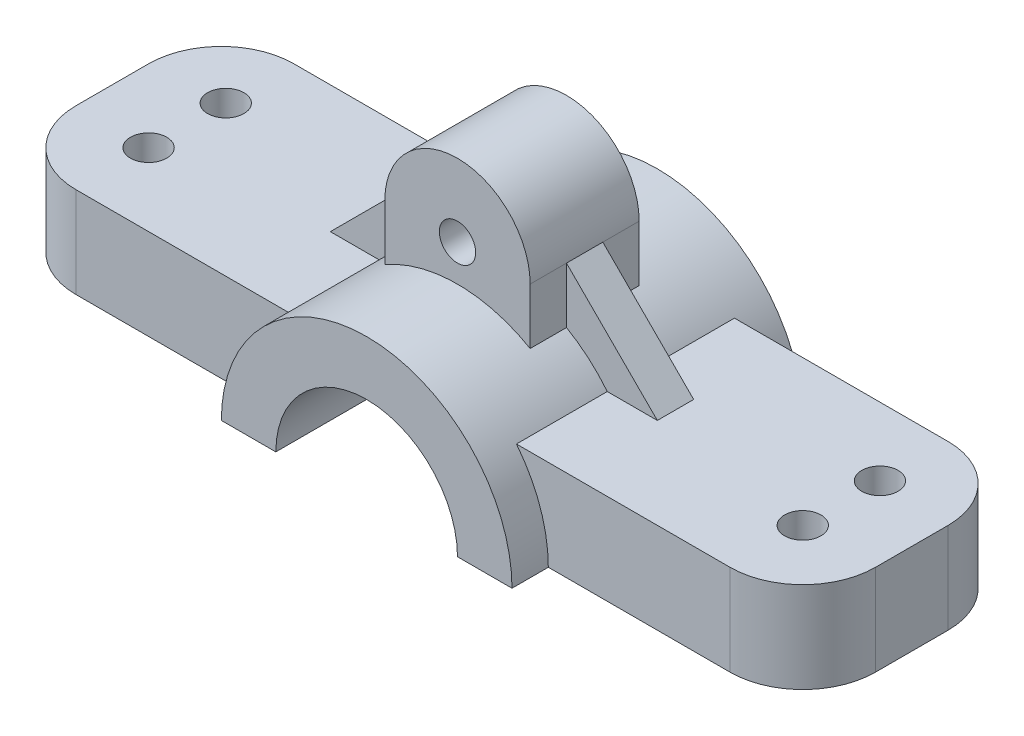
ISO-10303-21;
HEADER;
FILE_DESCRIPTION(('STEP AP214'),'2;1');
FILE_NAME('part.step','',(''),(''),'','','');
FILE_SCHEMA(('AUTOMOTIVE_DESIGN { 1 0 10303 214 1 1 1 1 }'));
ENDSEC;
DATA;
#1=APPLICATION_CONTEXT('core data for automotive mechanical design processes');
#2=APPLICATION_PROTOCOL_DEFINITION('international standard','automotive_design',2000,#1);
#3=PRODUCT_CONTEXT('',#1,'mechanical');
#4=PRODUCT('Part','Part','',(#3));
#5=PRODUCT_RELATED_PRODUCT_CATEGORY('part','',(#4));
#6=PRODUCT_DEFINITION_FORMATION('','',#4);
#7=PRODUCT_DEFINITION_CONTEXT('part definition',#1,'design');
#8=PRODUCT_DEFINITION('design','',#6,#7);
#9=PRODUCT_DEFINITION_SHAPE('','',#8);
#10=(LENGTH_UNIT() NAMED_UNIT(*) SI_UNIT(.MILLI.,.METRE.));
#11=(NAMED_UNIT(*) PLANE_ANGLE_UNIT() SI_UNIT($,.RADIAN.));
#12=(NAMED_UNIT(*) SI_UNIT($,.STERADIAN.) SOLID_ANGLE_UNIT());
#13=UNCERTAINTY_MEASURE_WITH_UNIT(LENGTH_MEASURE(1.E-05),#10,'distance_accuracy_value','');
#14=(GEOMETRIC_REPRESENTATION_CONTEXT(3) GLOBAL_UNCERTAINTY_ASSIGNED_CONTEXT((#13)) GLOBAL_UNIT_ASSIGNED_CONTEXT((#10,
#11,#12)) REPRESENTATION_CONTEXT('',''));
#15=CARTESIAN_POINT('',(0.,0.,0.));
#16=DIRECTION('',(0.,0.,1.));
#17=DIRECTION('',(1.,0.,0.));
#18=AXIS2_PLACEMENT_3D('',#15,#16,#17);
#19=CARTESIAN_POINT('',(0.,0.,40.));
#20=DIRECTION('',(0.,0.,-1.));
#21=DIRECTION('',(-1.,0.,0.));
#22=AXIS2_PLACEMENT_3D('',#19,#20,#21);
#23=CYLINDRICAL_SURFACE('',#22,40.);
#24=CARTESIAN_POINT('',(0.,0.,-5.));
#25=DIRECTION('',(0.,0.,1.));
#26=DIRECTION('',(1.,0.,0.));
#27=AXIS2_PLACEMENT_3D('',#24,#25,#26);
#28=CIRCLE('',#27,40.);
#29=CARTESIAN_POINT('',(31.224989991992,25.,-5.));
#30=VERTEX_POINT('',#29);
#31=CARTESIAN_POINT('',(20.,34.6410161513775,-5.));
#32=VERTEX_POINT('',#31);
#33=EDGE_CURVE('E253',#30,#32,#28,.T.);
#34=ORIENTED_EDGE('',*,*,#33,.F.);
#35=DIRECTION('',(0.,0.,-1.));
#36=VECTOR('',#35,1.);
#37=CARTESIAN_POINT('',(31.224989991992,25.,40.));
#38=LINE('',#37,#36);
#39=CARTESIAN_POINT('',(31.224989991992,25.,-30.));
#40=VERTEX_POINT('',#39);
#41=EDGE_CURVE('E250',#30,#40,#38,.T.);
#42=ORIENTED_EDGE('',*,*,#41,.T.);
#43=CARTESIAN_POINT('',(0.,0.,-30.));
#44=DIRECTION('',(0.,0.,1.));
#45=DIRECTION('',(1.,0.,0.));
#46=AXIS2_PLACEMENT_3D('',#43,#44,#45);
#47=CIRCLE('',#46,40.);
#48=CARTESIAN_POINT('',(40.,0.,-30.));
#49=VERTEX_POINT('',#48);
#50=EDGE_CURVE('E516',#49,#40,#47,.T.);
#51=ORIENTED_EDGE('',*,*,#50,.F.);
#52=DIRECTION('',(0.,0.,-1.));
#53=VECTOR('',#52,1.);
#54=CARTESIAN_POINT('',(40.,0.,40.));
#55=LINE('',#54,#53);
#56=CARTESIAN_POINT('',(40.,0.,-40.));
#57=VERTEX_POINT('',#56);
#58=EDGE_CURVE('E473',#49,#57,#55,.T.);
#59=ORIENTED_EDGE('',*,*,#58,.T.);
#60=CARTESIAN_POINT('',(0.,0.,-40.));
#61=DIRECTION('',(0.,0.,1.));
#62=DIRECTION('',(1.,0.,0.));
#63=AXIS2_PLACEMENT_3D('',#60,#61,#62);
#64=CIRCLE('',#63,40.);
#65=CARTESIAN_POINT('',(-40.,0.,-40.));
#66=VERTEX_POINT('',#65);
#67=EDGE_CURVE('E459',#57,#66,#64,.T.);
#68=ORIENTED_EDGE('',*,*,#67,.T.);
#69=DIRECTION('',(0.,0.,-1.));
#70=VECTOR('',#69,1.);
#71=CARTESIAN_POINT('',(-40.,0.,40.));
#72=LINE('',#71,#70);
#73=CARTESIAN_POINT('',(-40.,0.,-30.));
#74=VERTEX_POINT('',#73);
#75=EDGE_CURVE('E468',#74,#66,#72,.T.);
#76=ORIENTED_EDGE('',*,*,#75,.F.);
#77=CARTESIAN_POINT('',(0.,0.,-30.));
#78=DIRECTION('',(0.,0.,-1.));
#79=DIRECTION('',(-1.,0.,0.));
#80=AXIS2_PLACEMENT_3D('',#77,#78,#79);
#81=CIRCLE('',#80,40.);
#82=CARTESIAN_POINT('',(-31.224989991992,25.,-30.));
#83=VERTEX_POINT('',#82);
#84=EDGE_CURVE('E432',#74,#83,#81,.T.);
#85=ORIENTED_EDGE('',*,*,#84,.T.);
#86=DIRECTION('',(0.,0.,-1.));
#87=VECTOR('',#86,1.);
#88=CARTESIAN_POINT('',(-31.224989991992,25.,40.));
#89=LINE('',#88,#87);
#90=CARTESIAN_POINT('',(-31.224989991992,25.,-5.));
#91=VERTEX_POINT('',#90);
#92=EDGE_CURVE('E481',#83,#91,#89,.F.);
#93=ORIENTED_EDGE('',*,*,#92,.T.);
#94=CARTESIAN_POINT('',(0.,0.,-5.));
#95=DIRECTION('',(0.,0.,1.));
#96=DIRECTION('',(1.,0.,0.));
#97=AXIS2_PLACEMENT_3D('',#94,#95,#96);
#98=CIRCLE('',#97,40.);
#99=CARTESIAN_POINT('',(-20.,34.6410161513775,-5.));
#100=VERTEX_POINT('',#99);
#101=EDGE_CURVE('E278',#100,#91,#98,.T.);
#102=ORIENTED_EDGE('',*,*,#101,.F.);
#103=DIRECTION('',(0.,0.,-1.));
#104=VECTOR('',#103,1.);
#105=CARTESIAN_POINT('',(-20.,34.6410161513775,15.));
#106=LINE('',#105,#104);
#107=CARTESIAN_POINT('',(-20.,34.6410161513775,-15.));
#108=VERTEX_POINT('',#107);
#109=EDGE_CURVE('E316',#100,#108,#106,.T.);
#110=ORIENTED_EDGE('',*,*,#109,.T.);
#111=CARTESIAN_POINT('',(0.,0.,-15.));
#112=DIRECTION('',(0.,0.,1.));
#113=DIRECTION('',(1.,0.,0.));
#114=AXIS2_PLACEMENT_3D('',#111,#112,#113);
#115=CIRCLE('',#114,40.);
#116=CARTESIAN_POINT('',(20.,34.6410161513775,-15.));
#117=VERTEX_POINT('',#116);
#118=EDGE_CURVE('E296',#117,#108,#115,.T.);
#119=ORIENTED_EDGE('',*,*,#118,.F.);
#120=DIRECTION('',(0.,0.,-1.));
#121=VECTOR('',#120,1.);
#122=CARTESIAN_POINT('',(20.,34.6410161513775,15.));
#123=LINE('',#122,#121);
#124=EDGE_CURVE('E350',#32,#117,#123,.T.);
#125=ORIENTED_EDGE('',*,*,#124,.F.);
#126=EDGE_LOOP('',(#34,#42,#51,#59,#68,#76,#85,#93,#102,#110,#119,#125));
#127=FACE_BOUND('',#126,.T.);
#128=ADVANCED_FACE('F41',(#127),#23,.T.);
#129=CARTESIAN_POINT('',(20.,0.,15.));
#130=DIRECTION('',(1.,0.,0.));
#131=DIRECTION('',(0.,0.,-1.));
#132=AXIS2_PLACEMENT_3D('',#129,#130,#131);
#133=PLANE('',#132);
#134=DIRECTION('',(0.,0.,-1.));
#135=VECTOR('',#134,1.);
#136=CARTESIAN_POINT('',(20.,50.,15.));
#137=LINE('',#136,#135);
#138=CARTESIAN_POINT('',(20.,50.,-5.));
#139=VERTEX_POINT('',#138);
#140=CARTESIAN_POINT('',(20.,50.,-15.));
#141=VERTEX_POINT('',#140);
#142=EDGE_CURVE('E344',#139,#141,#137,.T.);
#143=ORIENTED_EDGE('',*,*,#142,.F.);
#144=DIRECTION('',(0.,-1.,0.));
#145=VECTOR('',#144,1.);
#146=CARTESIAN_POINT('',(20.,0.,-5.));
#147=LINE('',#146,#145);
#148=EDGE_CURVE('E242',#139,#32,#147,.T.);
#149=ORIENTED_EDGE('',*,*,#148,.T.);
#150=ORIENTED_EDGE('',*,*,#124,.T.);
#151=DIRECTION('',(0.,-1.,0.));
#152=VECTOR('',#151,1.);
#153=CARTESIAN_POINT('',(20.,0.,-15.));
#154=LINE('',#153,#152);
#155=EDGE_CURVE('E320',#141,#117,#154,.T.);
#156=ORIENTED_EDGE('',*,*,#155,.F.);
#157=EDGE_LOOP('',(#143,#149,#150,#156));
#158=FACE_BOUND('',#157,.T.);
#159=ADVANCED_FACE('F590',(#158),#133,.T.);
#160=CARTESIAN_POINT('',(-20.,0.,15.));
#161=DIRECTION('',(1.,0.,0.));
#162=DIRECTION('',(0.,0.,-1.));
#163=AXIS2_PLACEMENT_3D('',#160,#161,#162);
#164=PLANE('',#163);
#165=DIRECTION('',(0.,-1.,0.));
#166=VECTOR('',#165,1.);
#167=CARTESIAN_POINT('',(-20.,0.,-5.));
#168=LINE('',#167,#166);
#169=CARTESIAN_POINT('',(-20.,50.,-5.));
#170=VERTEX_POINT('',#169);
#171=EDGE_CURVE('E271',#170,#100,#168,.T.);
#172=ORIENTED_EDGE('',*,*,#171,.F.);
#173=DIRECTION('',(0.,0.,-1.));
#174=VECTOR('',#173,1.);
#175=CARTESIAN_POINT('',(-20.,50.,15.));
#176=LINE('',#175,#174);
#177=CARTESIAN_POINT('',(-20.,50.,-15.));
#178=VERTEX_POINT('',#177);
#179=EDGE_CURVE('E339',#170,#178,#176,.T.);
#180=ORIENTED_EDGE('',*,*,#179,.T.);
#181=DIRECTION('',(0.,-1.,0.));
#182=VECTOR('',#181,1.);
#183=CARTESIAN_POINT('',(-20.,0.,-15.));
#184=LINE('',#183,#182);
#185=EDGE_CURVE('E328',#178,#108,#184,.T.);
#186=ORIENTED_EDGE('',*,*,#185,.T.);
#187=ORIENTED_EDGE('',*,*,#109,.F.);
#188=EDGE_LOOP('',(#172,#180,#186,#187));
#189=FACE_BOUND('',#188,.T.);
#190=ADVANCED_FACE('F582',(#189),#164,.F.);
#191=CARTESIAN_POINT('',(0.,0.,40.));
#192=DIRECTION('',(0.,0.,-1.));
#193=DIRECTION('',(-1.,0.,0.));
#194=AXIS2_PLACEMENT_3D('',#191,#192,#193);
#195=CYLINDRICAL_SURFACE('',#194,25.);
#196=DIRECTION('',(0.,0.,-1.));
#197=VECTOR('',#196,1.);
#198=CARTESIAN_POINT('',(-25.,0.,40.));
#199=LINE('',#198,#197);
#200=CARTESIAN_POINT('',(-25.,0.,40.));
#201=VERTEX_POINT('',#200);
#202=CARTESIAN_POINT('',(-25.,0.,-40.));
#203=VERTEX_POINT('',#202);
#204=EDGE_CURVE('E451',#201,#203,#199,.T.);
#205=ORIENTED_EDGE('',*,*,#204,.T.);
#206=CARTESIAN_POINT('',(0.,0.,-40.));
#207=DIRECTION('',(0.,0.,-1.));
#208=DIRECTION('',(1.,0.,0.));
#209=AXIS2_PLACEMENT_3D('',#206,#207,#208);
#210=CIRCLE('',#209,25.);
#211=CARTESIAN_POINT('',(25.,0.,-40.));
#212=VERTEX_POINT('',#211);
#213=EDGE_CURVE('E436',#203,#212,#210,.T.);
#214=ORIENTED_EDGE('',*,*,#213,.T.);
#215=DIRECTION('',(0.,0.,-1.));
#216=VECTOR('',#215,1.);
#217=CARTESIAN_POINT('',(25.,0.,40.));
#218=LINE('',#217,#216);
#219=CARTESIAN_POINT('',(25.,0.,40.));
#220=VERTEX_POINT('',#219);
#221=EDGE_CURVE('E477',#220,#212,#218,.T.);
#222=ORIENTED_EDGE('',*,*,#221,.F.);
#223=CARTESIAN_POINT('',(0.,0.,40.));
#224=DIRECTION('',(0.,0.,-1.));
#225=DIRECTION('',(1.,0.,0.));
#226=AXIS2_PLACEMENT_3D('',#223,#224,#225);
#227=CIRCLE('',#226,25.);
#228=EDGE_CURVE('E437',#201,#220,#227,.T.);
#229=ORIENTED_EDGE('',*,*,#228,.F.);
#230=EDGE_LOOP('',(#205,#214,#222,#229));
#231=FACE_BOUND('',#230,.T.);
#232=ADVANCED_FACE('F646',(#231),#195,.F.);
#233=CARTESIAN_POINT('',(31.224989991992,25.,30.));
#234=VERTEX_POINT('',#233);
#235=CARTESIAN_POINT('',(31.224989991992,25.,5.));
#236=VERTEX_POINT('',#235);
#237=EDGE_CURVE('E512',#234,#236,#38,.T.);
#238=ORIENTED_EDGE('',*,*,#237,.T.);
#239=CARTESIAN_POINT('',(0.,0.,5.));
#240=DIRECTION('',(0.,0.,1.));
#241=DIRECTION('',(1.,0.,0.));
#242=AXIS2_PLACEMENT_3D('',#239,#240,#241);
#243=CIRCLE('',#242,40.);
#244=CARTESIAN_POINT('',(20.,34.6410161513775,5.));
#245=VERTEX_POINT('',#244);
#246=EDGE_CURVE('E257',#236,#245,#243,.T.);
#247=ORIENTED_EDGE('',*,*,#246,.T.);
#248=CARTESIAN_POINT('',(20.,34.6410161513775,15.));
#249=VERTEX_POINT('',#248);
#250=EDGE_CURVE('E352',#249,#245,#123,.T.);
#251=ORIENTED_EDGE('',*,*,#250,.F.);
#252=CARTESIAN_POINT('',(0.,0.,15.));
#253=DIRECTION('',(0.,0.,1.));
#254=DIRECTION('',(1.,0.,0.));
#255=AXIS2_PLACEMENT_3D('',#252,#253,#254);
#256=CIRCLE('',#255,40.);
#257=CARTESIAN_POINT('',(-20.,34.6410161513775,15.));
#258=VERTEX_POINT('',#257);
#259=EDGE_CURVE('E297',#249,#258,#256,.T.);
#260=ORIENTED_EDGE('',*,*,#259,.T.);
#261=CARTESIAN_POINT('',(-20.,34.6410161513775,5.));
#262=VERTEX_POINT('',#261);
#263=EDGE_CURVE('E335',#258,#262,#106,.T.);
#264=ORIENTED_EDGE('',*,*,#263,.T.);
#265=CARTESIAN_POINT('',(0.,0.,5.));
#266=DIRECTION('',(0.,0.,1.));
#267=DIRECTION('',(1.,0.,0.));
#268=AXIS2_PLACEMENT_3D('',#265,#266,#267);
#269=CIRCLE('',#268,40.);
#270=CARTESIAN_POINT('',(-31.224989991992,25.,5.));
#271=VERTEX_POINT('',#270);
#272=EDGE_CURVE('E288',#262,#271,#269,.T.);
#273=ORIENTED_EDGE('',*,*,#272,.T.);
#274=CARTESIAN_POINT('',(-31.224989991992,25.,30.));
#275=VERTEX_POINT('',#274);
#276=EDGE_CURVE('E480',#271,#275,#89,.F.);
#277=ORIENTED_EDGE('',*,*,#276,.T.);
#278=CARTESIAN_POINT('',(0.,0.,30.));
#279=DIRECTION('',(0.,0.,1.));
#280=DIRECTION('',(1.,0.,0.));
#281=AXIS2_PLACEMENT_3D('',#278,#279,#280);
#282=CIRCLE('',#281,40.);
#283=CARTESIAN_POINT('',(-40.,0.,30.));
#284=VERTEX_POINT('',#283);
#285=EDGE_CURVE('E420',#275,#284,#282,.T.);
#286=ORIENTED_EDGE('',*,*,#285,.T.);
#287=CARTESIAN_POINT('',(-40.,0.,40.));
#288=VERTEX_POINT('',#287);
#289=EDGE_CURVE('E469',#288,#284,#72,.T.);
#290=ORIENTED_EDGE('',*,*,#289,.F.);
#291=CARTESIAN_POINT('',(0.,0.,40.));
#292=DIRECTION('',(0.,0.,1.));
#293=DIRECTION('',(1.,0.,0.));
#294=AXIS2_PLACEMENT_3D('',#291,#292,#293);
#295=CIRCLE('',#294,40.);
#296=CARTESIAN_POINT('',(40.,0.,40.));
#297=VERTEX_POINT('',#296);
#298=EDGE_CURVE('E445',#297,#288,#295,.T.);
#299=ORIENTED_EDGE('',*,*,#298,.F.);
#300=CARTESIAN_POINT('',(40.,0.,30.));
#301=VERTEX_POINT('',#300);
#302=EDGE_CURVE('E474',#297,#301,#55,.T.);
#303=ORIENTED_EDGE('',*,*,#302,.T.);
#304=CARTESIAN_POINT('',(0.,0.,30.));
#305=DIRECTION('',(0.,0.,-1.));
#306=DIRECTION('',(-1.,0.,0.));
#307=AXIS2_PLACEMENT_3D('',#304,#305,#306);
#308=CIRCLE('',#307,40.);
#309=EDGE_CURVE('E520',#234,#301,#308,.T.);
#310=ORIENTED_EDGE('',*,*,#309,.F.);
#311=EDGE_LOOP('',(#238,#247,#251,#260,#264,#273,#277,#286,#290,#299,#303,#310));
#312=FACE_BOUND('',#311,.T.);
#313=ADVANCED_FACE('F605',(#312),#23,.T.);
#314=CARTESIAN_POINT('',(25.,0.,40.));
#315=DIRECTION('',(0.,1.,0.));
#316=DIRECTION('',(0.,0.,1.));
#317=AXIS2_PLACEMENT_3D('',#314,#315,#316);
#318=PLANE('',#317);
#319=CARTESIAN_POINT('',(90.0261306852017,0.,9.99999999999999));
#320=DIRECTION('',(0.,1.,0.));
#321=DIRECTION('',(0.,0.,1.));
#322=AXIS2_PLACEMENT_3D('',#319,#320,#321);
#323=CIRCLE('',#322,4.99999999999999);
#324=CARTESIAN_POINT('',(90.0261306852017,0.,15.));
#325=VERTEX_POINT('',#324);
#326=EDGE_CURVE('E360',#325,#325,#323,.T.);
#327=ORIENTED_EDGE('',*,*,#326,.T.);
#328=EDGE_LOOP('',(#327));
#329=FACE_BOUND('',#328,.T.);
#330=ORIENTED_EDGE('',*,*,#221,.T.);
#331=DIRECTION('',(1.,0.,0.));
#332=VECTOR('',#331,1.);
#333=CARTESIAN_POINT('',(25.,0.,-40.));
#334=LINE('',#333,#332);
#335=EDGE_CURVE('E455',#212,#57,#334,.T.);
#336=ORIENTED_EDGE('',*,*,#335,.T.);
#337=ORIENTED_EDGE('',*,*,#58,.F.);
#338=DIRECTION('',(-1.,0.,0.));
#339=VECTOR('',#338,1.);
#340=CARTESIAN_POINT('',(10.,0.,-30.));
#341=LINE('',#340,#339);
#342=CARTESIAN_POINT('',(90.0261306852017,0.,-30.));
#343=VERTEX_POINT('',#342);
#344=EDGE_CURVE('E372',#343,#49,#341,.T.);
#345=ORIENTED_EDGE('',*,*,#344,.F.);
#346=CARTESIAN_POINT('',(90.0261306852017,0.,-10.));
#347=DIRECTION('',(0.,1.,0.));
#348=DIRECTION('',(0.,0.,1.));
#349=AXIS2_PLACEMENT_3D('',#346,#347,#348);
#350=CIRCLE('',#349,20.);
#351=CARTESIAN_POINT('',(110.026130685202,0.,-10.));
#352=VERTEX_POINT('',#351);
#353=EDGE_CURVE('E531',#343,#352,#350,.F.);
#354=ORIENTED_EDGE('',*,*,#353,.T.);
#355=DIRECTION('',(0.,0.,-1.));
#356=VECTOR('',#355,1.);
#357=CARTESIAN_POINT('',(110.026130685202,0.,30.));
#358=LINE('',#357,#356);
#359=CARTESIAN_POINT('',(110.026130685202,0.,9.99999999999998));
#360=VERTEX_POINT('',#359);
#361=EDGE_CURVE('E387',#360,#352,#358,.T.);
#362=ORIENTED_EDGE('',*,*,#361,.F.);
#363=CARTESIAN_POINT('',(90.0261306852017,0.,9.99999999999999));
#364=DIRECTION('',(0.,1.,0.));
#365=DIRECTION('',(0.,0.,1.));
#366=AXIS2_PLACEMENT_3D('',#363,#364,#365);
#367=CIRCLE('',#366,20.);
#368=CARTESIAN_POINT('',(90.0261306852017,0.,30.));
#369=VERTEX_POINT('',#368);
#370=EDGE_CURVE('E528',#360,#369,#367,.F.);
#371=ORIENTED_EDGE('',*,*,#370,.T.);
#372=DIRECTION('',(1.,0.,0.));
#373=VECTOR('',#372,1.);
#374=CARTESIAN_POINT('',(10.,0.,30.));
#375=LINE('',#374,#373);
#376=EDGE_CURVE('E377',#301,#369,#375,.T.);
#377=ORIENTED_EDGE('',*,*,#376,.F.);
#378=ORIENTED_EDGE('',*,*,#302,.F.);
#379=DIRECTION('',(1.,0.,0.));
#380=VECTOR('',#379,1.);
#381=CARTESIAN_POINT('',(25.,0.,40.));
#382=LINE('',#381,#380);
#383=EDGE_CURVE('E441',#220,#297,#382,.T.);
#384=ORIENTED_EDGE('',*,*,#383,.F.);
#385=EDGE_LOOP('',(#330,#336,#337,#345,#354,#362,#371,#377,#378,#384));
#386=FACE_BOUND('',#385,.T.);
#387=CARTESIAN_POINT('',(90.0261306852017,0.,-11.2379023653091));
#388=DIRECTION('',(0.,1.,0.));
#389=DIRECTION('',(0.,0.,1.));
#390=AXIS2_PLACEMENT_3D('',#387,#388,#389);
#391=CIRCLE('',#390,4.99999999999999);
#392=CARTESIAN_POINT('',(90.0261306852017,0.,-6.23790236530909));
#393=VERTEX_POINT('',#392);
#394=EDGE_CURVE('E368',#393,#393,#391,.T.);
#395=ORIENTED_EDGE('',*,*,#394,.T.);
#396=EDGE_LOOP('',(#395));
#397=FACE_BOUND('',#396,.T.);
#398=ADVANCED_FACE('F559',(#329,#386,#397),#318,.F.);
#399=CARTESIAN_POINT('',(-40.,0.,40.));
#400=DIRECTION('',(0.,1.,0.));
#401=DIRECTION('',(0.,0.,1.));
#402=AXIS2_PLACEMENT_3D('',#399,#400,#401);
#403=PLANE('',#402);
#404=CARTESIAN_POINT('',(-90.0261306852017,0.,9.99999999999999));
#405=DIRECTION('',(0.,1.,0.));
#406=DIRECTION('',(0.,0.,1.));
#407=AXIS2_PLACEMENT_3D('',#404,#405,#406);
#408=CIRCLE('',#407,4.99999999999999);
#409=CARTESIAN_POINT('',(-90.0261306852017,0.,15.));
#410=VERTEX_POINT('',#409);
#411=EDGE_CURVE('E396',#410,#410,#408,.T.);
#412=ORIENTED_EDGE('',*,*,#411,.T.);
#413=EDGE_LOOP('',(#412));
#414=FACE_BOUND('',#413,.T.);
#415=DIRECTION('',(0.,0.,-1.));
#416=VECTOR('',#415,1.);
#417=CARTESIAN_POINT('',(-110.026130685202,0.,30.));
#418=LINE('',#417,#416);
#419=CARTESIAN_POINT('',(-110.026130685202,0.,9.99999999999998));
#420=VERTEX_POINT('',#419);
#421=CARTESIAN_POINT('',(-110.026130685202,0.,-10.));
#422=VERTEX_POINT('',#421);
#423=EDGE_CURVE('E424',#420,#422,#418,.T.);
#424=ORIENTED_EDGE('',*,*,#423,.T.);
#425=CARTESIAN_POINT('',(-90.0261306852017,0.,-10.));
#426=DIRECTION('',(0.,1.,0.));
#427=DIRECTION('',(0.,0.,1.));
#428=AXIS2_PLACEMENT_3D('',#425,#426,#427);
#429=CIRCLE('',#428,20.);
#430=CARTESIAN_POINT('',(-90.0261306852017,0.,-30.));
#431=VERTEX_POINT('',#430);
#432=EDGE_CURVE('E495',#422,#431,#429,.F.);
#433=ORIENTED_EDGE('',*,*,#432,.T.);
#434=DIRECTION('',(1.,0.,0.));
#435=VECTOR('',#434,1.);
#436=CARTESIAN_POINT('',(-10.,0.,-30.));
#437=LINE('',#436,#435);
#438=EDGE_CURVE('E414',#431,#74,#437,.T.);
#439=ORIENTED_EDGE('',*,*,#438,.T.);
#440=ORIENTED_EDGE('',*,*,#75,.T.);
#441=DIRECTION('',(1.,0.,0.));
#442=VECTOR('',#441,1.);
#443=CARTESIAN_POINT('',(-40.,0.,-40.));
#444=LINE('',#443,#442);
#445=EDGE_CURVE('E442',#66,#203,#444,.T.);
#446=ORIENTED_EDGE('',*,*,#445,.T.);
#447=ORIENTED_EDGE('',*,*,#204,.F.);
#448=DIRECTION('',(1.,0.,0.));
#449=VECTOR('',#448,1.);
#450=CARTESIAN_POINT('',(-40.,0.,40.));
#451=LINE('',#450,#449);
#452=EDGE_CURVE('E448',#288,#201,#451,.T.);
#453=ORIENTED_EDGE('',*,*,#452,.F.);
#454=ORIENTED_EDGE('',*,*,#289,.T.);
#455=DIRECTION('',(-1.,0.,0.));
#456=VECTOR('',#455,1.);
#457=CARTESIAN_POINT('',(-10.,0.,30.));
#458=LINE('',#457,#456);
#459=CARTESIAN_POINT('',(-90.0261306852017,0.,30.));
#460=VERTEX_POINT('',#459);
#461=EDGE_CURVE('E408',#284,#460,#458,.T.);
#462=ORIENTED_EDGE('',*,*,#461,.T.);
#463=CARTESIAN_POINT('',(-90.0261306852017,0.,9.99999999999999));
#464=DIRECTION('',(0.,1.,0.));
#465=DIRECTION('',(0.,0.,1.));
#466=AXIS2_PLACEMENT_3D('',#463,#464,#465);
#467=CIRCLE('',#466,20.);
#468=EDGE_CURVE('E492',#460,#420,#467,.F.);
#469=ORIENTED_EDGE('',*,*,#468,.T.);
#470=EDGE_LOOP('',(#424,#433,#439,#440,#446,#447,#453,#454,#462,#469));
#471=FACE_BOUND('',#470,.T.);
#472=CARTESIAN_POINT('',(-90.0261306852017,0.,-11.2379023653091));
#473=DIRECTION('',(0.,1.,0.));
#474=DIRECTION('',(0.,0.,1.));
#475=AXIS2_PLACEMENT_3D('',#472,#473,#474);
#476=CIRCLE('',#475,4.99999999999999);
#477=CARTESIAN_POINT('',(-90.0261306852017,0.,-6.23790236530909));
#478=VERTEX_POINT('',#477);
#479=EDGE_CURVE('E404',#478,#478,#476,.T.);
#480=ORIENTED_EDGE('',*,*,#479,.T.);
#481=EDGE_LOOP('',(#480));
#482=FACE_BOUND('',#481,.T.);
#483=ADVANCED_FACE('F651',(#414,#471,#482),#403,.F.);
#484=CARTESIAN_POINT('',(0.,0.,40.));
#485=DIRECTION('',(0.,0.,1.));
#486=DIRECTION('',(1.,0.,0.));
#487=AXIS2_PLACEMENT_3D('',#484,#485,#486);
#488=PLANE('',#487);
#489=ORIENTED_EDGE('',*,*,#228,.T.);
#490=ORIENTED_EDGE('',*,*,#383,.T.);
#491=ORIENTED_EDGE('',*,*,#298,.T.);
#492=ORIENTED_EDGE('',*,*,#452,.T.);
#493=EDGE_LOOP('',(#489,#490,#491,#492));
#494=FACE_BOUND('',#493,.T.);
#495=ADVANCED_FACE('F714',(#494),#488,.T.);
#496=CARTESIAN_POINT('',(0.,0.,-40.));
#497=DIRECTION('',(0.,0.,1.));
#498=DIRECTION('',(1.,0.,0.));
#499=AXIS2_PLACEMENT_3D('',#496,#497,#498);
#500=PLANE('',#499);
#501=ORIENTED_EDGE('',*,*,#213,.F.);
#502=ORIENTED_EDGE('',*,*,#445,.F.);
#503=ORIENTED_EDGE('',*,*,#67,.F.);
#504=ORIENTED_EDGE('',*,*,#335,.F.);
#505=EDGE_LOOP('',(#501,#502,#503,#504));
#506=FACE_BOUND('',#505,.T.);
#507=ADVANCED_FACE('F709',(#506),#500,.F.);
#508=CARTESIAN_POINT('',(-110.026130685202,25.,30.));
#509=DIRECTION('',(-1.,0.,0.));
#510=DIRECTION('',(0.,0.,1.));
#511=AXIS2_PLACEMENT_3D('',#508,#509,#510);
#512=PLANE('',#511);
#513=DIRECTION('',(0.,0.,-1.));
#514=VECTOR('',#513,1.);
#515=CARTESIAN_POINT('',(-110.026130685202,25.,30.));
#516=LINE('',#515,#514);
#517=CARTESIAN_POINT('',(-110.026130685202,25.,9.99999999999998));
#518=VERTEX_POINT('',#517);
#519=CARTESIAN_POINT('',(-110.026130685202,25.,-10.));
#520=VERTEX_POINT('',#519);
#521=EDGE_CURVE('E413',#518,#520,#516,.T.);
#522=ORIENTED_EDGE('',*,*,#521,.T.);
#523=DIRECTION('',(0.,-1.,0.));
#524=VECTOR('',#523,1.);
#525=CARTESIAN_POINT('',(-110.026130685202,25.,-10.));
#526=LINE('',#525,#524);
#527=EDGE_CURVE('E488',#520,#422,#526,.T.);
#528=ORIENTED_EDGE('',*,*,#527,.T.);
#529=ORIENTED_EDGE('',*,*,#423,.F.);
#530=DIRECTION('',(0.,-1.,0.));
#531=VECTOR('',#530,1.);
#532=CARTESIAN_POINT('',(-110.026130685202,25.,9.99999999999998));
#533=LINE('',#532,#531);
#534=EDGE_CURVE('E485',#420,#518,#533,.F.);
#535=ORIENTED_EDGE('',*,*,#534,.T.);
#536=EDGE_LOOP('',(#522,#528,#529,#535));
#537=FACE_BOUND('',#536,.T.);
#538=ADVANCED_FACE('F706',(#537),#512,.T.);
#539=CARTESIAN_POINT('',(-10.,25.,30.));
#540=DIRECTION('',(0.,0.,1.));
#541=DIRECTION('',(1.,0.,0.));
#542=AXIS2_PLACEMENT_3D('',#539,#540,#541);
#543=PLANE('',#542);
#544=DIRECTION('',(-1.,0.,0.));
#545=VECTOR('',#544,1.);
#546=CARTESIAN_POINT('',(-10.,25.,30.));
#547=LINE('',#546,#545);
#548=CARTESIAN_POINT('',(-90.0261306852017,25.,30.));
#549=VERTEX_POINT('',#548);
#550=EDGE_CURVE('E409',#275,#549,#547,.T.);
#551=ORIENTED_EDGE('',*,*,#550,.T.);
#552=DIRECTION('',(0.,-1.,0.));
#553=VECTOR('',#552,1.);
#554=CARTESIAN_POINT('',(-90.0261306852017,25.,30.));
#555=LINE('',#554,#553);
#556=EDGE_CURVE('E508',#549,#460,#555,.T.);
#557=ORIENTED_EDGE('',*,*,#556,.T.);
#558=ORIENTED_EDGE('',*,*,#461,.F.);
#559=ORIENTED_EDGE('',*,*,#285,.F.);
#560=EDGE_LOOP('',(#551,#557,#558,#559));
#561=FACE_BOUND('',#560,.T.);
#562=ADVANCED_FACE('F704',(#561),#543,.T.);
#563=CARTESIAN_POINT('',(-10.,25.,-30.));
#564=DIRECTION('',(0.,0.,-1.));
#565=DIRECTION('',(-1.,0.,0.));
#566=AXIS2_PLACEMENT_3D('',#563,#564,#565);
#567=PLANE('',#566);
#568=ORIENTED_EDGE('',*,*,#438,.F.);
#569=DIRECTION('',(0.,-1.,0.));
#570=VECTOR('',#569,1.);
#571=CARTESIAN_POINT('',(-90.0261306852017,25.,-30.));
#572=LINE('',#571,#570);
#573=CARTESIAN_POINT('',(-90.0261306852017,25.,-30.));
#574=VERTEX_POINT('',#573);
#575=EDGE_CURVE('E498',#431,#574,#572,.F.);
#576=ORIENTED_EDGE('',*,*,#575,.T.);
#577=DIRECTION('',(1.,0.,0.));
#578=VECTOR('',#577,1.);
#579=CARTESIAN_POINT('',(-10.,25.,-30.));
#580=LINE('',#579,#578);
#581=EDGE_CURVE('E417',#574,#83,#580,.T.);
#582=ORIENTED_EDGE('',*,*,#581,.T.);
#583=ORIENTED_EDGE('',*,*,#84,.F.);
#584=EDGE_LOOP('',(#568,#576,#582,#583));
#585=FACE_BOUND('',#584,.T.);
#586=ADVANCED_FACE('F700',(#585),#567,.T.);
#587=CARTESIAN_POINT('',(0.,25.,0.));
#588=DIRECTION('',(0.,1.,0.));
#589=DIRECTION('',(0.,0.,1.));
#590=AXIS2_PLACEMENT_3D('',#587,#588,#589);
#591=PLANE('',#590);
#592=CARTESIAN_POINT('',(-90.0261306852017,25.,9.99999999999999));
#593=DIRECTION('',(0.,1.,0.));
#594=DIRECTION('',(0.,0.,1.));
#595=AXIS2_PLACEMENT_3D('',#592,#593,#594);
#596=CIRCLE('',#595,5.);
#597=CARTESIAN_POINT('',(-90.0261306852017,25.,15.));
#598=VERTEX_POINT('',#597);
#599=EDGE_CURVE('E384',#598,#598,#596,.T.);
#600=ORIENTED_EDGE('',*,*,#599,.F.);
#601=EDGE_LOOP('',(#600));
#602=FACE_BOUND('',#601,.T.);
#603=CARTESIAN_POINT('',(-90.0261306852017,25.,-10.));
#604=DIRECTION('',(0.,1.,0.));
#605=DIRECTION('',(0.,0.,1.));
#606=AXIS2_PLACEMENT_3D('',#603,#604,#605);
#607=CIRCLE('',#606,20.);
#608=EDGE_CURVE('E504',#574,#520,#607,.T.);
#609=ORIENTED_EDGE('',*,*,#608,.T.);
#610=ORIENTED_EDGE('',*,*,#521,.F.);
#611=CARTESIAN_POINT('',(-90.0261306852017,25.,9.99999999999999));
#612=DIRECTION('',(0.,1.,0.));
#613=DIRECTION('',(0.,0.,1.));
#614=AXIS2_PLACEMENT_3D('',#611,#612,#613);
#615=CIRCLE('',#614,20.);
#616=EDGE_CURVE('E501',#518,#549,#615,.T.);
#617=ORIENTED_EDGE('',*,*,#616,.T.);
#618=ORIENTED_EDGE('',*,*,#550,.F.);
#619=ORIENTED_EDGE('',*,*,#276,.F.);
#620=DIRECTION('',(1.,0.,0.));
#621=VECTOR('',#620,1.);
#622=CARTESIAN_POINT('',(0.,25.,5.));
#623=LINE('',#622,#621);
#624=CARTESIAN_POINT('',(-45.,25.,5.));
#625=VERTEX_POINT('',#624);
#626=EDGE_CURVE('E65',#625,#271,#623,.T.);
#627=ORIENTED_EDGE('',*,*,#626,.F.);
#628=DIRECTION('',(0.,0.,1.));
#629=VECTOR('',#628,1.);
#630=CARTESIAN_POINT('',(-45.,25.,0.));
#631=LINE('',#630,#629);
#632=CARTESIAN_POINT('',(-45.,25.,-5.));
#633=VERTEX_POINT('',#632);
#634=EDGE_CURVE('E293',#633,#625,#631,.T.);
#635=ORIENTED_EDGE('',*,*,#634,.F.);
#636=DIRECTION('',(1.,0.,0.));
#637=VECTOR('',#636,1.);
#638=CARTESIAN_POINT('',(0.,25.,-5.));
#639=LINE('',#638,#637);
#640=EDGE_CURVE('E282',#633,#91,#639,.T.);
#641=ORIENTED_EDGE('',*,*,#640,.T.);
#642=ORIENTED_EDGE('',*,*,#92,.F.);
#643=ORIENTED_EDGE('',*,*,#581,.F.);
#644=EDGE_LOOP('',(#609,#610,#617,#618,#619,#627,#635,#641,#642,#643));
#645=FACE_BOUND('',#644,.T.);
#646=CARTESIAN_POINT('',(-90.0261306852017,25.,-11.2379023653091));
#647=DIRECTION('',(0.,1.,0.));
#648=DIRECTION('',(0.,0.,1.));
#649=AXIS2_PLACEMENT_3D('',#646,#647,#648);
#650=CIRCLE('',#649,5.);
#651=CARTESIAN_POINT('',(-90.0261306852017,25.,-6.23790236530908));
#652=VERTEX_POINT('',#651);
#653=EDGE_CURVE('E400',#652,#652,#650,.T.);
#654=ORIENTED_EDGE('',*,*,#653,.F.);
#655=EDGE_LOOP('',(#654));
#656=FACE_BOUND('',#655,.T.);
#657=ADVANCED_FACE('F623',(#602,#645,#656),#591,.T.);
#658=CARTESIAN_POINT('',(-90.0261306852017,25.,-10.));
#659=DIRECTION('',(0.,-1.,0.));
#660=DIRECTION('',(0.,0.,-1.));
#661=AXIS2_PLACEMENT_3D('',#658,#659,#660);
#662=CYLINDRICAL_SURFACE('',#661,20.);
#663=ORIENTED_EDGE('',*,*,#608,.F.);
#664=ORIENTED_EDGE('',*,*,#575,.F.);
#665=ORIENTED_EDGE('',*,*,#432,.F.);
#666=ORIENTED_EDGE('',*,*,#527,.F.);
#667=EDGE_LOOP('',(#663,#664,#665,#666));
#668=FACE_BOUND('',#667,.T.);
#669=ADVANCED_FACE('F660',(#668),#662,.T.);
#670=CARTESIAN_POINT('',(-90.0261306852017,25.,9.99999999999999));
#671=DIRECTION('',(0.,-1.,0.));
#672=DIRECTION('',(0.,0.,-1.));
#673=AXIS2_PLACEMENT_3D('',#670,#671,#672);
#674=CYLINDRICAL_SURFACE('',#673,20.);
#675=ORIENTED_EDGE('',*,*,#616,.F.);
#676=ORIENTED_EDGE('',*,*,#534,.F.);
#677=ORIENTED_EDGE('',*,*,#468,.F.);
#678=ORIENTED_EDGE('',*,*,#556,.F.);
#679=EDGE_LOOP('',(#675,#676,#677,#678));
#680=FACE_BOUND('',#679,.T.);
#681=ADVANCED_FACE('F663',(#680),#674,.T.);
#682=CARTESIAN_POINT('',(-90.0261306852017,25.,-11.2379023653091));
#683=DIRECTION('',(0.,1.,0.));
#684=DIRECTION('',(0.,0.,1.));
#685=AXIS2_PLACEMENT_3D('',#682,#683,#684);
#686=CYLINDRICAL_SURFACE('',#685,5.);
#687=ORIENTED_EDGE('',*,*,#479,.F.);
#688=EDGE_LOOP('',(#687));
#689=FACE_BOUND('',#688,.T.);
#690=ORIENTED_EDGE('',*,*,#653,.T.);
#691=EDGE_LOOP('',(#690));
#692=FACE_BOUND('',#691,.T.);
#693=ADVANCED_FACE('F666',(#689,#692),#686,.F.);
#694=CARTESIAN_POINT('',(-90.0261306852017,25.,9.99999999999999));
#695=DIRECTION('',(0.,1.,0.));
#696=DIRECTION('',(0.,0.,1.));
#697=AXIS2_PLACEMENT_3D('',#694,#695,#696);
#698=CYLINDRICAL_SURFACE('',#697,5.);
#699=ORIENTED_EDGE('',*,*,#411,.F.);
#700=EDGE_LOOP('',(#699));
#701=FACE_BOUND('',#700,.T.);
#702=ORIENTED_EDGE('',*,*,#599,.T.);
#703=EDGE_LOOP('',(#702));
#704=FACE_BOUND('',#703,.T.);
#705=ADVANCED_FACE('F691',(#701,#704),#698,.F.);
#706=CARTESIAN_POINT('',(10.,25.,-30.));
#707=DIRECTION('',(0.,0.,1.));
#708=DIRECTION('',(1.,0.,0.));
#709=AXIS2_PLACEMENT_3D('',#706,#707,#708);
#710=PLANE('',#709);
#711=DIRECTION('',(-1.,0.,0.));
#712=VECTOR('',#711,1.);
#713=CARTESIAN_POINT('',(10.,25.,-30.));
#714=LINE('',#713,#712);
#715=CARTESIAN_POINT('',(90.0261306852017,25.,-30.));
#716=VERTEX_POINT('',#715);
#717=EDGE_CURVE('E373',#716,#40,#714,.T.);
#718=ORIENTED_EDGE('',*,*,#717,.F.);
#719=DIRECTION('',(0.,-1.,0.));
#720=VECTOR('',#719,1.);
#721=CARTESIAN_POINT('',(90.0261306852017,25.,-30.));
#722=LINE('',#721,#720);
#723=EDGE_CURVE('E524',#716,#343,#722,.T.);
#724=ORIENTED_EDGE('',*,*,#723,.T.);
#725=ORIENTED_EDGE('',*,*,#344,.T.);
#726=ORIENTED_EDGE('',*,*,#50,.T.);
#727=EDGE_LOOP('',(#718,#724,#725,#726));
#728=FACE_BOUND('',#727,.T.);
#729=ADVANCED_FACE('F553',(#728),#710,.F.);
#730=CARTESIAN_POINT('',(110.026130685202,25.,30.));
#731=DIRECTION('',(-1.,0.,0.));
#732=DIRECTION('',(0.,0.,1.));
#733=AXIS2_PLACEMENT_3D('',#730,#731,#732);
#734=PLANE('',#733);
#735=ORIENTED_EDGE('',*,*,#361,.T.);
#736=DIRECTION('',(0.,-1.,0.));
#737=VECTOR('',#736,1.);
#738=CARTESIAN_POINT('',(110.026130685202,25.,-10.));
#739=LINE('',#738,#737);
#740=CARTESIAN_POINT('',(110.026130685202,25.,-10.));
#741=VERTEX_POINT('',#740);
#742=EDGE_CURVE('E539',#352,#741,#739,.F.);
#743=ORIENTED_EDGE('',*,*,#742,.T.);
#744=DIRECTION('',(0.,0.,-1.));
#745=VECTOR('',#744,1.);
#746=CARTESIAN_POINT('',(110.026130685202,25.,30.));
#747=LINE('',#746,#745);
#748=CARTESIAN_POINT('',(110.026130685202,25.,9.99999999999998));
#749=VERTEX_POINT('',#748);
#750=EDGE_CURVE('E376',#749,#741,#747,.T.);
#751=ORIENTED_EDGE('',*,*,#750,.F.);
#752=DIRECTION('',(0.,-1.,0.));
#753=VECTOR('',#752,1.);
#754=CARTESIAN_POINT('',(110.026130685202,25.,9.99999999999998));
#755=LINE('',#754,#753);
#756=EDGE_CURVE('E535',#749,#360,#755,.T.);
#757=ORIENTED_EDGE('',*,*,#756,.T.);
#758=EDGE_LOOP('',(#735,#743,#751,#757));
#759=FACE_BOUND('',#758,.T.);
#760=ADVANCED_FACE('F680',(#759),#734,.F.);
#761=CARTESIAN_POINT('',(10.,25.,30.));
#762=DIRECTION('',(0.,0.,-1.));
#763=DIRECTION('',(-1.,0.,0.));
#764=AXIS2_PLACEMENT_3D('',#761,#762,#763);
#765=PLANE('',#764);
#766=ORIENTED_EDGE('',*,*,#376,.T.);
#767=DIRECTION('',(0.,-1.,0.));
#768=VECTOR('',#767,1.);
#769=CARTESIAN_POINT('',(90.0261306852017,25.,30.));
#770=LINE('',#769,#768);
#771=CARTESIAN_POINT('',(90.0261306852017,25.,30.));
#772=VERTEX_POINT('',#771);
#773=EDGE_CURVE('E11',#369,#772,#770,.F.);
#774=ORIENTED_EDGE('',*,*,#773,.T.);
#775=DIRECTION('',(1.,0.,0.));
#776=VECTOR('',#775,1.);
#777=CARTESIAN_POINT('',(10.,25.,30.));
#778=LINE('',#777,#776);
#779=EDGE_CURVE('E380',#234,#772,#778,.T.);
#780=ORIENTED_EDGE('',*,*,#779,.F.);
#781=ORIENTED_EDGE('',*,*,#309,.T.);
#782=EDGE_LOOP('',(#766,#774,#780,#781));
#783=FACE_BOUND('',#782,.T.);
#784=ADVANCED_FACE('F675',(#783),#765,.F.);
#785=CARTESIAN_POINT('',(0.,25.,0.));
#786=DIRECTION('',(0.,1.,0.));
#787=DIRECTION('',(0.,0.,1.));
#788=AXIS2_PLACEMENT_3D('',#785,#786,#787);
#789=PLANE('',#788);
#790=DIRECTION('',(1.,0.,0.));
#791=VECTOR('',#790,1.);
#792=CARTESIAN_POINT('',(0.,25.,5.));
#793=LINE('',#792,#791);
#794=CARTESIAN_POINT('',(45.,25.,5.));
#795=VERTEX_POINT('',#794);
#796=EDGE_CURVE('E235',#236,#795,#793,.T.);
#797=ORIENTED_EDGE('',*,*,#796,.F.);
#798=ORIENTED_EDGE('',*,*,#237,.F.);
#799=ORIENTED_EDGE('',*,*,#779,.T.);
#800=CARTESIAN_POINT('',(90.0261306852017,25.,9.99999999999999));
#801=DIRECTION('',(0.,1.,0.));
#802=DIRECTION('',(0.,0.,1.));
#803=AXIS2_PLACEMENT_3D('',#800,#801,#802);
#804=CIRCLE('',#803,20.);
#805=EDGE_CURVE('E543',#772,#749,#804,.T.);
#806=ORIENTED_EDGE('',*,*,#805,.T.);
#807=ORIENTED_EDGE('',*,*,#750,.T.);
#808=CARTESIAN_POINT('',(90.0261306852017,25.,-10.));
#809=DIRECTION('',(0.,1.,0.));
#810=DIRECTION('',(0.,0.,1.));
#811=AXIS2_PLACEMENT_3D('',#808,#809,#810);
#812=CIRCLE('',#811,20.);
#813=EDGE_CURVE('E50',#741,#716,#812,.T.);
#814=ORIENTED_EDGE('',*,*,#813,.T.);
#815=ORIENTED_EDGE('',*,*,#717,.T.);
#816=ORIENTED_EDGE('',*,*,#41,.F.);
#817=DIRECTION('',(1.,0.,0.));
#818=VECTOR('',#817,1.);
#819=CARTESIAN_POINT('',(0.,25.,-5.));
#820=LINE('',#819,#818);
#821=CARTESIAN_POINT('',(45.,25.,-5.));
#822=VERTEX_POINT('',#821);
#823=EDGE_CURVE('E239',#30,#822,#820,.T.);
#824=ORIENTED_EDGE('',*,*,#823,.T.);
#825=DIRECTION('',(0.,0.,1.));
#826=VECTOR('',#825,1.);
#827=CARTESIAN_POINT('',(45.,25.,0.));
#828=LINE('',#827,#826);
#829=EDGE_CURVE('E226',#795,#822,#828,.F.);
#830=ORIENTED_EDGE('',*,*,#829,.F.);
#831=EDGE_LOOP('',(#797,#798,#799,#806,#807,#814,#815,#816,#824,#830));
#832=FACE_BOUND('',#831,.T.);
#833=CARTESIAN_POINT('',(90.0261306852017,25.,9.99999999999999));
#834=DIRECTION('',(0.,1.,0.));
#835=DIRECTION('',(0.,0.,1.));
#836=AXIS2_PLACEMENT_3D('',#833,#834,#835);
#837=CIRCLE('',#836,5.);
#838=CARTESIAN_POINT('',(90.0261306852017,25.,15.));
#839=VERTEX_POINT('',#838);
#840=EDGE_CURVE('E356',#839,#839,#837,.T.);
#841=ORIENTED_EDGE('',*,*,#840,.F.);
#842=EDGE_LOOP('',(#841));
#843=FACE_BOUND('',#842,.T.);
#844=CARTESIAN_POINT('',(90.0261306852017,25.,-11.2379023653091));
#845=DIRECTION('',(0.,1.,0.));
#846=DIRECTION('',(0.,0.,1.));
#847=AXIS2_PLACEMENT_3D('',#844,#845,#846);
#848=CIRCLE('',#847,5.);
#849=CARTESIAN_POINT('',(90.0261306852017,25.,-6.23790236530908));
#850=VERTEX_POINT('',#849);
#851=EDGE_CURVE('E364',#850,#850,#848,.T.);
#852=ORIENTED_EDGE('',*,*,#851,.F.);
#853=EDGE_LOOP('',(#852));
#854=FACE_BOUND('',#853,.T.);
#855=ADVANCED_FACE('F247',(#832,#843,#854),#789,.T.);
#856=CARTESIAN_POINT('',(90.0261306852017,25.,-10.));
#857=DIRECTION('',(0.,-1.,0.));
#858=DIRECTION('',(0.,0.,-1.));
#859=AXIS2_PLACEMENT_3D('',#856,#857,#858);
#860=CYLINDRICAL_SURFACE('',#859,20.);
#861=ORIENTED_EDGE('',*,*,#813,.F.);
#862=ORIENTED_EDGE('',*,*,#742,.F.);
#863=ORIENTED_EDGE('',*,*,#353,.F.);
#864=ORIENTED_EDGE('',*,*,#723,.F.);
#865=EDGE_LOOP('',(#861,#862,#863,#864));
#866=FACE_BOUND('',#865,.T.);
#867=ADVANCED_FACE('F556',(#866),#860,.T.);
#868=CARTESIAN_POINT('',(90.0261306852017,25.,9.99999999999999));
#869=DIRECTION('',(0.,-1.,0.));
#870=DIRECTION('',(0.,0.,-1.));
#871=AXIS2_PLACEMENT_3D('',#868,#869,#870);
#872=CYLINDRICAL_SURFACE('',#871,20.);
#873=ORIENTED_EDGE('',*,*,#805,.F.);
#874=ORIENTED_EDGE('',*,*,#773,.F.);
#875=ORIENTED_EDGE('',*,*,#370,.F.);
#876=ORIENTED_EDGE('',*,*,#756,.F.);
#877=EDGE_LOOP('',(#873,#874,#875,#876));
#878=FACE_BOUND('',#877,.T.);
#879=ADVANCED_FACE('F43',(#878),#872,.T.);
#880=CARTESIAN_POINT('',(90.0261306852017,25.,-11.2379023653091));
#881=DIRECTION('',(0.,1.,0.));
#882=DIRECTION('',(0.,0.,1.));
#883=AXIS2_PLACEMENT_3D('',#880,#881,#882);
#884=CYLINDRICAL_SURFACE('',#883,5.);
#885=ORIENTED_EDGE('',*,*,#394,.F.);
#886=EDGE_LOOP('',(#885));
#887=FACE_BOUND('',#886,.T.);
#888=ORIENTED_EDGE('',*,*,#851,.T.);
#889=EDGE_LOOP('',(#888));
#890=FACE_BOUND('',#889,.T.);
#891=ADVANCED_FACE('F673',(#887,#890),#884,.F.);
#892=CARTESIAN_POINT('',(90.0261306852017,25.,9.99999999999999));
#893=DIRECTION('',(0.,1.,0.));
#894=DIRECTION('',(0.,0.,1.));
#895=AXIS2_PLACEMENT_3D('',#892,#893,#894);
#896=CYLINDRICAL_SURFACE('',#895,5.);
#897=ORIENTED_EDGE('',*,*,#326,.F.);
#898=EDGE_LOOP('',(#897));
#899=FACE_BOUND('',#898,.T.);
#900=ORIENTED_EDGE('',*,*,#840,.T.);
#901=EDGE_LOOP('',(#900));
#902=FACE_BOUND('',#901,.T.);
#903=ADVANCED_FACE('F838',(#899,#902),#896,.F.);
#904=DIRECTION('',(0.,-1.,0.));
#905=VECTOR('',#904,1.);
#906=CARTESIAN_POINT('',(20.,0.,5.));
#907=LINE('',#906,#905);
#908=CARTESIAN_POINT('',(20.,50.,5.));
#909=VERTEX_POINT('',#908);
#910=EDGE_CURVE('E252',#909,#245,#907,.T.);
#911=ORIENTED_EDGE('',*,*,#910,.F.);
#912=CARTESIAN_POINT('',(20.,50.,15.));
#913=VERTEX_POINT('',#912);
#914=EDGE_CURVE('E346',#913,#909,#137,.T.);
#915=ORIENTED_EDGE('',*,*,#914,.F.);
#916=DIRECTION('',(0.,-1.,0.));
#917=VECTOR('',#916,1.);
#918=CARTESIAN_POINT('',(20.,0.,15.));
#919=LINE('',#918,#917);
#920=EDGE_CURVE('E300',#913,#249,#919,.T.);
#921=ORIENTED_EDGE('',*,*,#920,.T.);
#922=ORIENTED_EDGE('',*,*,#250,.T.);
#923=EDGE_LOOP('',(#911,#915,#921,#922));
#924=FACE_BOUND('',#923,.T.);
#925=ADVANCED_FACE('F601',(#924),#133,.T.);
#926=CARTESIAN_POINT('',(0.,50.,15.));
#927=DIRECTION('',(0.,0.,-1.));
#928=DIRECTION('',(-1.,0.,0.));
#929=AXIS2_PLACEMENT_3D('',#926,#927,#928);
#930=CYLINDRICAL_SURFACE('',#929,20.);
#931=CARTESIAN_POINT('',(-20.,50.,5.));
#932=VERTEX_POINT('',#931);
#933=EDGE_CURVE('E345',#932,#170,#176,.T.);
#934=ORIENTED_EDGE('',*,*,#933,.F.);
#935=CARTESIAN_POINT('',(-20.,50.,15.));
#936=VERTEX_POINT('',#935);
#937=EDGE_CURVE('E340',#936,#932,#176,.T.);
#938=ORIENTED_EDGE('',*,*,#937,.F.);
#939=CARTESIAN_POINT('',(0.,50.,15.));
#940=DIRECTION('',(0.,0.,1.));
#941=DIRECTION('',(1.,0.,0.));
#942=AXIS2_PLACEMENT_3D('',#939,#940,#941);
#943=CIRCLE('',#942,20.);
#944=EDGE_CURVE('E305',#913,#936,#943,.T.);
#945=ORIENTED_EDGE('',*,*,#944,.F.);
#946=ORIENTED_EDGE('',*,*,#914,.T.);
#947=EDGE_CURVE('E351',#909,#139,#137,.T.);
#948=ORIENTED_EDGE('',*,*,#947,.T.);
#949=ORIENTED_EDGE('',*,*,#142,.T.);
#950=CARTESIAN_POINT('',(0.,50.,-15.));
#951=DIRECTION('',(0.,0.,1.));
#952=DIRECTION('',(1.,0.,0.));
#953=AXIS2_PLACEMENT_3D('',#950,#951,#952);
#954=CIRCLE('',#953,20.);
#955=EDGE_CURVE('E324',#141,#178,#954,.T.);
#956=ORIENTED_EDGE('',*,*,#955,.T.);
#957=ORIENTED_EDGE('',*,*,#179,.F.);
#958=EDGE_LOOP('',(#934,#938,#945,#946,#948,#949,#956,#957));
#959=FACE_BOUND('',#958,.T.);
#960=ADVANCED_FACE('F595',(#959),#930,.T.);
#961=ORIENTED_EDGE('',*,*,#937,.T.);
#962=DIRECTION('',(0.,-1.,0.));
#963=VECTOR('',#962,1.);
#964=CARTESIAN_POINT('',(-20.,0.,5.));
#965=LINE('',#964,#963);
#966=EDGE_CURVE('E285',#932,#262,#965,.T.);
#967=ORIENTED_EDGE('',*,*,#966,.T.);
#968=ORIENTED_EDGE('',*,*,#263,.F.);
#969=DIRECTION('',(0.,-1.,0.));
#970=VECTOR('',#969,1.);
#971=CARTESIAN_POINT('',(-20.,0.,15.));
#972=LINE('',#971,#970);
#973=EDGE_CURVE('E308',#936,#258,#972,.T.);
#974=ORIENTED_EDGE('',*,*,#973,.F.);
#975=EDGE_LOOP('',(#961,#967,#968,#974));
#976=FACE_BOUND('',#975,.T.);
#977=ADVANCED_FACE('F613',(#976),#164,.F.);
#978=CARTESIAN_POINT('',(0.,50.,15.));
#979=DIRECTION('',(0.,0.,-1.));
#980=DIRECTION('',(-1.,0.,0.));
#981=AXIS2_PLACEMENT_3D('',#978,#979,#980);
#982=CYLINDRICAL_SURFACE('',#981,5.);
#983=CARTESIAN_POINT('',(0.,50.,15.));
#984=DIRECTION('',(0.,0.,1.));
#985=DIRECTION('',(1.,0.,0.));
#986=AXIS2_PLACEMENT_3D('',#983,#984,#985);
#987=CIRCLE('',#986,5.);
#988=CARTESIAN_POINT('',(5.,50.,15.));
#989=VERTEX_POINT('',#988);
#990=EDGE_CURVE('E312',#989,#989,#987,.T.);
#991=ORIENTED_EDGE('',*,*,#990,.T.);
#992=EDGE_LOOP('',(#991));
#993=FACE_BOUND('',#992,.T.);
#994=CARTESIAN_POINT('',(0.,50.,-15.));
#995=DIRECTION('',(0.,0.,1.));
#996=DIRECTION('',(1.,0.,0.));
#997=AXIS2_PLACEMENT_3D('',#994,#995,#996);
#998=CIRCLE('',#997,5.);
#999=CARTESIAN_POINT('',(5.,50.,-15.));
#1000=VERTEX_POINT('',#999);
#1001=EDGE_CURVE('E301',#1000,#1000,#998,.T.);
#1002=ORIENTED_EDGE('',*,*,#1001,.F.);
#1003=EDGE_LOOP('',(#1002));
#1004=FACE_BOUND('',#1003,.T.);
#1005=ADVANCED_FACE('F849',(#993,#1004),#982,.F.);
#1006=CARTESIAN_POINT('',(0.,0.,15.));
#1007=DIRECTION('',(0.,0.,1.));
#1008=DIRECTION('',(1.,0.,0.));
#1009=AXIS2_PLACEMENT_3D('',#1006,#1007,#1008);
#1010=PLANE('',#1009);
#1011=ORIENTED_EDGE('',*,*,#259,.F.);
#1012=ORIENTED_EDGE('',*,*,#920,.F.);
#1013=ORIENTED_EDGE('',*,*,#944,.T.);
#1014=ORIENTED_EDGE('',*,*,#973,.T.);
#1015=EDGE_LOOP('',(#1011,#1012,#1013,#1014));
#1016=FACE_BOUND('',#1015,.T.);
#1017=ORIENTED_EDGE('',*,*,#990,.F.);
#1018=EDGE_LOOP('',(#1017));
#1019=FACE_BOUND('',#1018,.T.);
#1020=ADVANCED_FACE('F607',(#1016,#1019),#1010,.T.);
#1021=CARTESIAN_POINT('',(0.,0.,-15.));
#1022=DIRECTION('',(0.,0.,1.));
#1023=DIRECTION('',(1.,0.,0.));
#1024=AXIS2_PLACEMENT_3D('',#1021,#1022,#1023);
#1025=PLANE('',#1024);
#1026=ORIENTED_EDGE('',*,*,#118,.T.);
#1027=ORIENTED_EDGE('',*,*,#185,.F.);
#1028=ORIENTED_EDGE('',*,*,#955,.F.);
#1029=ORIENTED_EDGE('',*,*,#155,.T.);
#1030=EDGE_LOOP('',(#1026,#1027,#1028,#1029));
#1031=FACE_BOUND('',#1030,.T.);
#1032=ORIENTED_EDGE('',*,*,#1001,.T.);
#1033=EDGE_LOOP('',(#1032));
#1034=FACE_BOUND('',#1033,.T.);
#1035=ADVANCED_FACE('F586',(#1031,#1034),#1025,.F.);
#1036=CARTESIAN_POINT('',(-20.,50.,0.));
#1037=DIRECTION('',(-0.707106781186548,0.707106781186547,0.));
#1038=DIRECTION('',(-0.707106781186547,-0.707106781186548,0.));
#1039=AXIS2_PLACEMENT_3D('',#1036,#1037,#1038);
#1040=PLANE('',#1039);
#1041=DIRECTION('',(-0.707106781186547,-0.707106781186548,0.));
#1042=VECTOR('',#1041,1.);
#1043=CARTESIAN_POINT('',(-20.,50.,-5.));
#1044=LINE('',#1043,#1042);
#1045=EDGE_CURVE('E234',#170,#633,#1044,.T.);
#1046=ORIENTED_EDGE('',*,*,#1045,.T.);
#1047=ORIENTED_EDGE('',*,*,#634,.T.);
#1048=DIRECTION('',(-0.707106781186547,-0.707106781186548,0.));
#1049=VECTOR('',#1048,1.);
#1050=CARTESIAN_POINT('',(-20.,50.,5.));
#1051=LINE('',#1050,#1049);
#1052=EDGE_CURVE('E267',#932,#625,#1051,.T.);
#1053=ORIENTED_EDGE('',*,*,#1052,.F.);
#1054=ORIENTED_EDGE('',*,*,#933,.T.);
#1055=EDGE_LOOP('',(#1046,#1047,#1053,#1054));
#1056=FACE_BOUND('',#1055,.T.);
#1057=ADVANCED_FACE('F620',(#1056),#1040,.T.);
#1058=CARTESIAN_POINT('',(0.,35.,5.));
#1059=DIRECTION('',(0.,0.,1.));
#1060=DIRECTION('',(1.,0.,0.));
#1061=AXIS2_PLACEMENT_3D('',#1058,#1059,#1060);
#1062=PLANE('',#1061);
#1063=ORIENTED_EDGE('',*,*,#1052,.T.);
#1064=ORIENTED_EDGE('',*,*,#626,.T.);
#1065=ORIENTED_EDGE('',*,*,#272,.F.);
#1066=ORIENTED_EDGE('',*,*,#966,.F.);
#1067=EDGE_LOOP('',(#1063,#1064,#1065,#1066));
#1068=FACE_BOUND('',#1067,.T.);
#1069=ADVANCED_FACE('F617',(#1068),#1062,.T.);
#1070=CARTESIAN_POINT('',(0.,35.,-5.));
#1071=DIRECTION('',(0.,0.,1.));
#1072=DIRECTION('',(1.,0.,0.));
#1073=AXIS2_PLACEMENT_3D('',#1070,#1071,#1072);
#1074=PLANE('',#1073);
#1075=ORIENTED_EDGE('',*,*,#640,.F.);
#1076=ORIENTED_EDGE('',*,*,#1045,.F.);
#1077=ORIENTED_EDGE('',*,*,#171,.T.);
#1078=ORIENTED_EDGE('',*,*,#101,.T.);
#1079=EDGE_LOOP('',(#1075,#1076,#1077,#1078));
#1080=FACE_BOUND('',#1079,.T.);
#1081=ADVANCED_FACE('F627',(#1080),#1074,.F.);
#1082=CARTESIAN_POINT('',(20.,50.,0.));
#1083=DIRECTION('',(-0.707106781186548,-0.707106781186547,0.));
#1084=DIRECTION('',(0.707106781186547,-0.707106781186548,0.));
#1085=AXIS2_PLACEMENT_3D('',#1082,#1083,#1084);
#1086=PLANE('',#1085);
#1087=DIRECTION('',(0.707106781186547,-0.707106781186548,0.));
#1088=VECTOR('',#1087,1.);
#1089=CARTESIAN_POINT('',(20.,50.,5.));
#1090=LINE('',#1089,#1088);
#1091=EDGE_CURVE('E229',#909,#795,#1090,.T.);
#1092=ORIENTED_EDGE('',*,*,#1091,.T.);
#1093=ORIENTED_EDGE('',*,*,#829,.T.);
#1094=DIRECTION('',(0.707106781186547,-0.707106781186548,0.));
#1095=VECTOR('',#1094,1.);
#1096=CARTESIAN_POINT('',(20.,50.,-5.));
#1097=LINE('',#1096,#1095);
#1098=EDGE_CURVE('E57',#139,#822,#1097,.T.);
#1099=ORIENTED_EDGE('',*,*,#1098,.F.);
#1100=ORIENTED_EDGE('',*,*,#947,.F.);
#1101=EDGE_LOOP('',(#1092,#1093,#1099,#1100));
#1102=FACE_BOUND('',#1101,.T.);
#1103=ADVANCED_FACE('F227',(#1102),#1086,.F.);
#1104=CARTESIAN_POINT('',(0.,35.,5.));
#1105=DIRECTION('',(0.,0.,1.));
#1106=DIRECTION('',(1.,0.,0.));
#1107=AXIS2_PLACEMENT_3D('',#1104,#1105,#1106);
#1108=PLANE('',#1107);
#1109=ORIENTED_EDGE('',*,*,#246,.F.);
#1110=ORIENTED_EDGE('',*,*,#796,.T.);
#1111=ORIENTED_EDGE('',*,*,#1091,.F.);
#1112=ORIENTED_EDGE('',*,*,#910,.T.);
#1113=EDGE_LOOP('',(#1109,#1110,#1111,#1112));
#1114=FACE_BOUND('',#1113,.T.);
#1115=ADVANCED_FACE('F599',(#1114),#1108,.T.);
#1116=CARTESIAN_POINT('',(0.,35.,-5.));
#1117=DIRECTION('',(0.,0.,1.));
#1118=DIRECTION('',(1.,0.,0.));
#1119=AXIS2_PLACEMENT_3D('',#1116,#1117,#1118);
#1120=PLANE('',#1119);
#1121=ORIENTED_EDGE('',*,*,#823,.F.);
#1122=ORIENTED_EDGE('',*,*,#33,.T.);
#1123=ORIENTED_EDGE('',*,*,#148,.F.);
#1124=ORIENTED_EDGE('',*,*,#1098,.T.);
#1125=EDGE_LOOP('',(#1121,#1122,#1123,#1124));
#1126=FACE_BOUND('',#1125,.T.);
#1127=ADVANCED_FACE('F238',(#1126),#1120,.F.);
#1128=CLOSED_SHELL('',(#128,#159,#190,#232,#313,#398,#483,#495,#507,#538,#562,#586,#657,#669,
#681,#693,#705,#729,#760,#784,#855,#867,#879,#891,#903,#925,#960,#977,#1005,#1020,#1035,#1057,
#1069,#1081,#1103,#1115,#1127));
#1129=MANIFOLD_SOLID_BREP('B2',#1128);
#1130=ADVANCED_BREP_SHAPE_REPRESENTATION('',(#18,#1129),#14);
#1131=SHAPE_DEFINITION_REPRESENTATION(#9,#1130);
ENDSEC;
END-ISO-10303-21;
